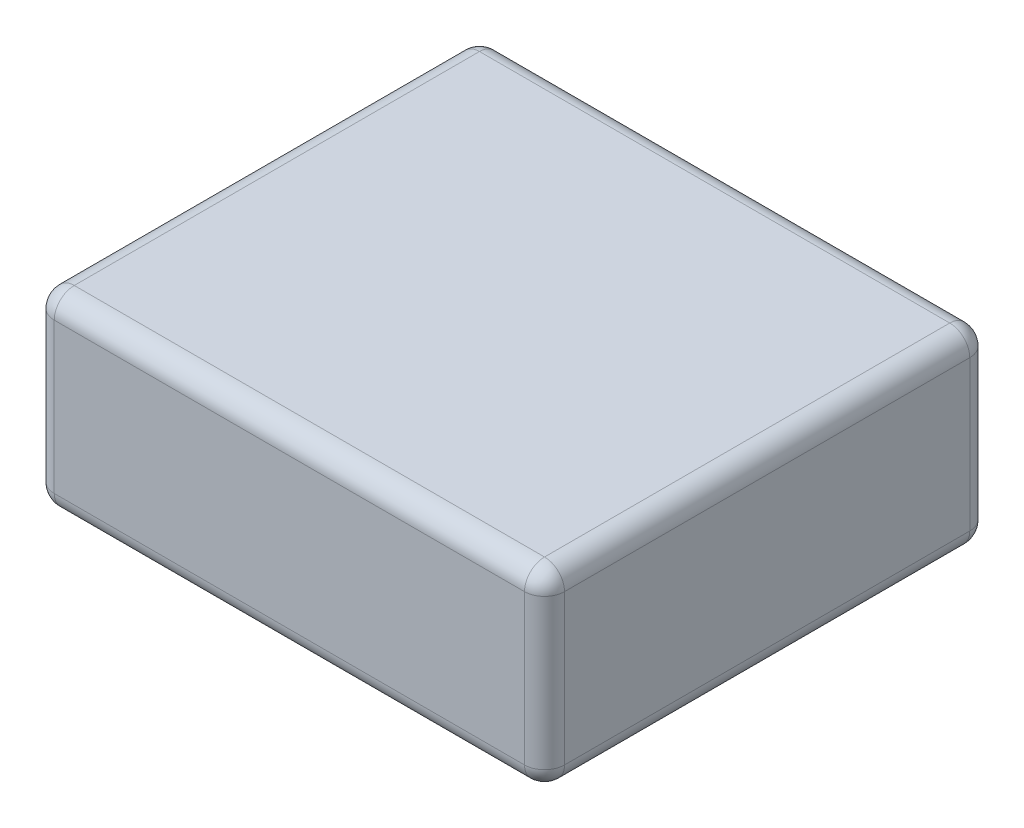
ISO-10303-21;
HEADER;
FILE_DESCRIPTION(('STEP AP214'),'2;1');
FILE_NAME('part.step','',(''),(''),'','','');
FILE_SCHEMA(('AUTOMOTIVE_DESIGN { 1 0 10303 214 1 1 1 1 }'));
ENDSEC;
DATA;
#1=APPLICATION_CONTEXT('core data for automotive mechanical design processes');
#2=APPLICATION_PROTOCOL_DEFINITION('international standard','automotive_design',2000,#1);
#3=PRODUCT_CONTEXT('',#1,'mechanical');
#4=PRODUCT('Part','Part','',(#3));
#5=PRODUCT_RELATED_PRODUCT_CATEGORY('part','',(#4));
#6=PRODUCT_DEFINITION_FORMATION('','',#4);
#7=PRODUCT_DEFINITION_CONTEXT('part definition',#1,'design');
#8=PRODUCT_DEFINITION('design','',#6,#7);
#9=PRODUCT_DEFINITION_SHAPE('','',#8);
#10=(LENGTH_UNIT() NAMED_UNIT(*) SI_UNIT(.MILLI.,.METRE.));
#11=(NAMED_UNIT(*) PLANE_ANGLE_UNIT() SI_UNIT($,.RADIAN.));
#12=(NAMED_UNIT(*) SI_UNIT($,.STERADIAN.) SOLID_ANGLE_UNIT());
#13=UNCERTAINTY_MEASURE_WITH_UNIT(LENGTH_MEASURE(1.E-05),#10,'distance_accuracy_value','');
#14=(GEOMETRIC_REPRESENTATION_CONTEXT(3) GLOBAL_UNCERTAINTY_ASSIGNED_CONTEXT((#13)) GLOBAL_UNIT_ASSIGNED_CONTEXT((#10,
#11,#12)) REPRESENTATION_CONTEXT('',''));
#15=CARTESIAN_POINT('',(0.,0.,0.));
#16=DIRECTION('',(0.,0.,1.));
#17=DIRECTION('',(1.,0.,0.));
#18=AXIS2_PLACEMENT_3D('',#15,#16,#17);
#19=CARTESIAN_POINT('',(-44.5,38.,-44.5));
#20=DIRECTION('',(1.,0.,0.));
#21=DIRECTION('',(0.,0.,-1.));
#22=AXIS2_PLACEMENT_3D('',#19,#20,#21);
#23=PLANE('',#22);
#24=DIRECTION('',(0.,0.,1.));
#25=VECTOR('',#24,1.);
#26=CARTESIAN_POINT('',(-44.5,34.,-44.5));
#27=LINE('',#26,#25);
#28=CARTESIAN_POINT('',(-44.5,34.,40.5));
#29=VERTEX_POINT('',#28);
#30=CARTESIAN_POINT('',(-44.5,34.,-40.5));
#31=VERTEX_POINT('',#30);
#32=EDGE_CURVE('E138',#29,#31,#27,.F.);
#33=ORIENTED_EDGE('',*,*,#32,.T.);
#34=DIRECTION('',(0.,-1.,0.));
#35=VECTOR('',#34,1.);
#36=CARTESIAN_POINT('',(-44.5,38.,-40.5));
#37=LINE('',#36,#35);
#38=CARTESIAN_POINT('',(-44.5,4.,-40.5));
#39=VERTEX_POINT('',#38);
#40=EDGE_CURVE('E181',#31,#39,#37,.T.);
#41=ORIENTED_EDGE('',*,*,#40,.T.);
#42=DIRECTION('',(0.,0.,1.));
#43=VECTOR('',#42,1.);
#44=CARTESIAN_POINT('',(-44.5,4.,-44.5));
#45=LINE('',#44,#43);
#46=CARTESIAN_POINT('',(-44.5,4.,40.5));
#47=VERTEX_POINT('',#46);
#48=EDGE_CURVE('E141',#39,#47,#45,.T.);
#49=ORIENTED_EDGE('',*,*,#48,.T.);
#50=DIRECTION('',(0.,-1.,0.));
#51=VECTOR('',#50,1.);
#52=CARTESIAN_POINT('',(-44.5,38.,40.5));
#53=LINE('',#52,#51);
#54=EDGE_CURVE('E134',#47,#29,#53,.F.);
#55=ORIENTED_EDGE('',*,*,#54,.T.);
#56=EDGE_LOOP('',(#33,#41,#49,#55));
#57=FACE_BOUND('',#56,.T.);
#58=ADVANCED_FACE('F45',(#57),#23,.F.);
#59=CARTESIAN_POINT('',(-44.5,38.,44.5));
#60=DIRECTION('',(0.,0.,-1.));
#61=DIRECTION('',(-1.,0.,0.));
#62=AXIS2_PLACEMENT_3D('',#59,#60,#61);
#63=PLANE('',#62);
#64=DIRECTION('',(0.,-1.,0.));
#65=VECTOR('',#64,1.);
#66=CARTESIAN_POINT('',(-40.5,38.,44.5));
#67=LINE('',#66,#65);
#68=CARTESIAN_POINT('',(-40.5,34.,44.5));
#69=VERTEX_POINT('',#68);
#70=CARTESIAN_POINT('',(-40.5,4.,44.5));
#71=VERTEX_POINT('',#70);
#72=EDGE_CURVE('E153',#69,#71,#67,.T.);
#73=ORIENTED_EDGE('',*,*,#72,.T.);
#74=DIRECTION('',(1.,0.,0.));
#75=VECTOR('',#74,1.);
#76=CARTESIAN_POINT('',(-44.5,4.,44.5));
#77=LINE('',#76,#75);
#78=CARTESIAN_POINT('',(53.5,4.,44.5));
#79=VERTEX_POINT('',#78);
#80=EDGE_CURVE('E231',#71,#79,#77,.T.);
#81=ORIENTED_EDGE('',*,*,#80,.T.);
#82=DIRECTION('',(0.,-1.,0.));
#83=VECTOR('',#82,1.);
#84=CARTESIAN_POINT('',(53.5,38.,44.5));
#85=LINE('',#84,#83);
#86=CARTESIAN_POINT('',(53.5,34.,44.5));
#87=VERTEX_POINT('',#86);
#88=EDGE_CURVE('E226',#79,#87,#85,.F.);
#89=ORIENTED_EDGE('',*,*,#88,.T.);
#90=DIRECTION('',(1.,0.,0.));
#91=VECTOR('',#90,1.);
#92=CARTESIAN_POINT('',(-44.5,34.,44.5));
#93=LINE('',#92,#91);
#94=EDGE_CURVE('E223',#87,#69,#93,.F.);
#95=ORIENTED_EDGE('',*,*,#94,.T.);
#96=EDGE_LOOP('',(#73,#81,#89,#95));
#97=FACE_BOUND('',#96,.T.);
#98=ADVANCED_FACE('F354',(#97),#63,.F.);
#99=CARTESIAN_POINT('',(57.5,38.,-44.5));
#100=DIRECTION('',(-1.,0.,0.));
#101=DIRECTION('',(0.,0.,1.));
#102=AXIS2_PLACEMENT_3D('',#99,#100,#101);
#103=PLANE('',#102);
#104=DIRECTION('',(0.,0.,-1.));
#105=VECTOR('',#104,1.);
#106=CARTESIAN_POINT('',(57.5,4.,-44.5));
#107=LINE('',#106,#105);
#108=CARTESIAN_POINT('',(57.5,4.,40.5));
#109=VERTEX_POINT('',#108);
#110=CARTESIAN_POINT('',(57.5,4.,-40.5));
#111=VERTEX_POINT('',#110);
#112=EDGE_CURVE('E216',#109,#111,#107,.T.);
#113=ORIENTED_EDGE('',*,*,#112,.T.);
#114=DIRECTION('',(0.,-1.,0.));
#115=VECTOR('',#114,1.);
#116=CARTESIAN_POINT('',(57.5,38.,-40.5));
#117=LINE('',#116,#115);
#118=CARTESIAN_POINT('',(57.5,34.,-40.5));
#119=VERTEX_POINT('',#118);
#120=EDGE_CURVE('E219',#111,#119,#117,.F.);
#121=ORIENTED_EDGE('',*,*,#120,.T.);
#122=DIRECTION('',(0.,0.,-1.));
#123=VECTOR('',#122,1.);
#124=CARTESIAN_POINT('',(57.5,34.,44.5));
#125=LINE('',#124,#123);
#126=CARTESIAN_POINT('',(57.5,34.,40.5));
#127=VERTEX_POINT('',#126);
#128=EDGE_CURVE('E210',#119,#127,#125,.F.);
#129=ORIENTED_EDGE('',*,*,#128,.T.);
#130=DIRECTION('',(0.,-1.,0.));
#131=VECTOR('',#130,1.);
#132=CARTESIAN_POINT('',(57.5,38.,40.5));
#133=LINE('',#132,#131);
#134=EDGE_CURVE('E213',#127,#109,#133,.T.);
#135=ORIENTED_EDGE('',*,*,#134,.T.);
#136=EDGE_LOOP('',(#113,#121,#129,#135));
#137=FACE_BOUND('',#136,.T.);
#138=ADVANCED_FACE('F333',(#137),#103,.F.);
#139=CARTESIAN_POINT('',(-44.5,38.,-44.5));
#140=DIRECTION('',(0.,0.,1.));
#141=DIRECTION('',(1.,0.,0.));
#142=AXIS2_PLACEMENT_3D('',#139,#140,#141);
#143=PLANE('',#142);
#144=DIRECTION('',(-1.,0.,0.));
#145=VECTOR('',#144,1.);
#146=CARTESIAN_POINT('',(-44.5,4.,-44.5));
#147=LINE('',#146,#145);
#148=CARTESIAN_POINT('',(53.5,4.,-44.5));
#149=VERTEX_POINT('',#148);
#150=CARTESIAN_POINT('',(-40.5,4.,-44.5));
#151=VERTEX_POINT('',#150);
#152=EDGE_CURVE('E190',#149,#151,#147,.T.);
#153=ORIENTED_EDGE('',*,*,#152,.T.);
#154=DIRECTION('',(0.,-1.,0.));
#155=VECTOR('',#154,1.);
#156=CARTESIAN_POINT('',(-40.5,38.,-44.5));
#157=LINE('',#156,#155);
#158=CARTESIAN_POINT('',(-40.5,34.,-44.5));
#159=VERTEX_POINT('',#158);
#160=EDGE_CURVE('E193',#151,#159,#157,.F.);
#161=ORIENTED_EDGE('',*,*,#160,.T.);
#162=DIRECTION('',(-1.,0.,0.));
#163=VECTOR('',#162,1.);
#164=CARTESIAN_POINT('',(57.5,34.,-44.5));
#165=LINE('',#164,#163);
#166=CARTESIAN_POINT('',(53.5,34.,-44.5));
#167=VERTEX_POINT('',#166);
#168=EDGE_CURVE('E184',#159,#167,#165,.F.);
#169=ORIENTED_EDGE('',*,*,#168,.T.);
#170=DIRECTION('',(0.,-1.,0.));
#171=VECTOR('',#170,1.);
#172=CARTESIAN_POINT('',(53.5,38.,-44.5));
#173=LINE('',#172,#171);
#174=EDGE_CURVE('E187',#167,#149,#173,.T.);
#175=ORIENTED_EDGE('',*,*,#174,.T.);
#176=EDGE_LOOP('',(#153,#161,#169,#175));
#177=FACE_BOUND('',#176,.T.);
#178=ADVANCED_FACE('F361',(#177),#143,.F.);
#179=CARTESIAN_POINT('',(0.,38.,0.));
#180=DIRECTION('',(0.,1.,0.));
#181=DIRECTION('',(0.,0.,1.));
#182=AXIS2_PLACEMENT_3D('',#179,#180,#181);
#183=PLANE('',#182);
#184=DIRECTION('',(0.,0.,-1.));
#185=VECTOR('',#184,1.);
#186=CARTESIAN_POINT('',(53.5,38.,-44.5));
#187=LINE('',#186,#185);
#188=CARTESIAN_POINT('',(53.5,38.,40.5));
#189=VERTEX_POINT('',#188);
#190=CARTESIAN_POINT('',(53.5,38.,-40.5));
#191=VERTEX_POINT('',#190);
#192=EDGE_CURVE('E55',#189,#191,#187,.T.);
#193=ORIENTED_EDGE('',*,*,#192,.T.);
#194=DIRECTION('',(-1.,0.,0.));
#195=VECTOR('',#194,1.);
#196=CARTESIAN_POINT('',(-44.5,38.,-40.5));
#197=LINE('',#196,#195);
#198=CARTESIAN_POINT('',(-40.5,38.,-40.5));
#199=VERTEX_POINT('',#198);
#200=EDGE_CURVE('E11',#191,#199,#197,.T.);
#201=ORIENTED_EDGE('',*,*,#200,.T.);
#202=DIRECTION('',(0.,0.,1.));
#203=VECTOR('',#202,1.);
#204=CARTESIAN_POINT('',(-40.5,38.,44.5));
#205=LINE('',#204,#203);
#206=CARTESIAN_POINT('',(-40.5,38.,40.5));
#207=VERTEX_POINT('',#206);
#208=EDGE_CURVE('E234',#199,#207,#205,.T.);
#209=ORIENTED_EDGE('',*,*,#208,.T.);
#210=DIRECTION('',(1.,0.,0.));
#211=VECTOR('',#210,1.);
#212=CARTESIAN_POINT('',(57.5,38.,40.5));
#213=LINE('',#212,#211);
#214=EDGE_CURVE('E66',#207,#189,#213,.T.);
#215=ORIENTED_EDGE('',*,*,#214,.T.);
#216=EDGE_LOOP('',(#193,#201,#209,#215));
#217=FACE_BOUND('',#216,.T.);
#218=ADVANCED_FACE('F425',(#217),#183,.T.);
#219=CARTESIAN_POINT('',(0.,0.,0.));
#220=DIRECTION('',(0.,1.,0.));
#221=DIRECTION('',(0.,0.,1.));
#222=AXIS2_PLACEMENT_3D('',#219,#220,#221);
#223=PLANE('',#222);
#224=DIRECTION('',(0.,0.,1.));
#225=VECTOR('',#224,1.);
#226=CARTESIAN_POINT('',(-40.5,0.,0.));
#227=LINE('',#226,#225);
#228=CARTESIAN_POINT('',(-40.5,0.,40.5));
#229=VERTEX_POINT('',#228);
#230=CARTESIAN_POINT('',(-40.5,0.,-40.5));
#231=VERTEX_POINT('',#230);
#232=EDGE_CURVE('E203',#229,#231,#227,.F.);
#233=ORIENTED_EDGE('',*,*,#232,.T.);
#234=DIRECTION('',(-1.,0.,0.));
#235=VECTOR('',#234,1.);
#236=CARTESIAN_POINT('',(0.,0.,-40.5));
#237=LINE('',#236,#235);
#238=CARTESIAN_POINT('',(53.5,0.,-40.5));
#239=VERTEX_POINT('',#238);
#240=EDGE_CURVE('E206',#231,#239,#237,.F.);
#241=ORIENTED_EDGE('',*,*,#240,.T.);
#242=DIRECTION('',(0.,0.,-1.));
#243=VECTOR('',#242,1.);
#244=CARTESIAN_POINT('',(53.5,0.,0.));
#245=LINE('',#244,#243);
#246=CARTESIAN_POINT('',(53.5,0.,40.5));
#247=VERTEX_POINT('',#246);
#248=EDGE_CURVE('E200',#239,#247,#245,.F.);
#249=ORIENTED_EDGE('',*,*,#248,.T.);
#250=DIRECTION('',(1.,0.,0.));
#251=VECTOR('',#250,1.);
#252=CARTESIAN_POINT('',(0.,0.,40.5));
#253=LINE('',#252,#251);
#254=EDGE_CURVE('E197',#247,#229,#253,.F.);
#255=ORIENTED_EDGE('',*,*,#254,.T.);
#256=EDGE_LOOP('',(#233,#241,#249,#255));
#257=FACE_BOUND('',#256,.T.);
#258=ADVANCED_FACE('F324',(#257),#223,.F.);
#259=CARTESIAN_POINT('',(53.5,38.,40.5));
#260=DIRECTION('',(0.,-1.,0.));
#261=DIRECTION('',(0.,0.,-1.));
#262=AXIS2_PLACEMENT_3D('',#259,#260,#261);
#263=CYLINDRICAL_SURFACE('',#262,4.);
#264=CARTESIAN_POINT('',(53.5,34.,40.5));
#265=DIRECTION('',(0.,1.,0.));
#266=DIRECTION('',(0.,0.,1.));
#267=AXIS2_PLACEMENT_3D('',#264,#265,#266);
#268=CIRCLE('',#267,4.);
#269=EDGE_CURVE('E49',#87,#127,#268,.T.);
#270=ORIENTED_EDGE('',*,*,#269,.F.);
#271=ORIENTED_EDGE('',*,*,#88,.F.);
#272=CARTESIAN_POINT('',(53.5,4.,40.5));
#273=DIRECTION('',(0.,-1.,0.));
#274=DIRECTION('',(0.,0.,-1.));
#275=AXIS2_PLACEMENT_3D('',#272,#273,#274);
#276=CIRCLE('',#275,4.);
#277=EDGE_CURVE('E177',#109,#79,#276,.T.);
#278=ORIENTED_EDGE('',*,*,#277,.F.);
#279=ORIENTED_EDGE('',*,*,#134,.F.);
#280=EDGE_LOOP('',(#270,#271,#278,#279));
#281=FACE_BOUND('',#280,.T.);
#282=ADVANCED_FACE('F47',(#281),#263,.T.);
#283=CARTESIAN_POINT('',(53.5,34.,40.5));
#284=DIRECTION('',(1.,0.,0.));
#285=DIRECTION('',(0.,0.,-1.));
#286=AXIS2_PLACEMENT_3D('',#283,#284,#285);
#287=SPHERICAL_SURFACE('',#286,4.);
#288=CARTESIAN_POINT('',(53.5,34.,40.5));
#289=DIRECTION('',(1.,0.,0.));
#290=DIRECTION('',(0.,0.,-1.));
#291=AXIS2_PLACEMENT_3D('',#288,#289,#290);
#292=CIRCLE('',#291,4.);
#293=EDGE_CURVE('E300',#87,#189,#292,.F.);
#294=ORIENTED_EDGE('',*,*,#293,.F.);
#295=ORIENTED_EDGE('',*,*,#269,.T.);
#296=CARTESIAN_POINT('',(53.5,34.,40.5));
#297=DIRECTION('',(0.,0.,1.));
#298=DIRECTION('',(0.,-1.,0.));
#299=AXIS2_PLACEMENT_3D('',#296,#297,#298);
#300=CIRCLE('',#299,4.);
#301=EDGE_CURVE('E303',#189,#127,#300,.F.);
#302=ORIENTED_EDGE('',*,*,#301,.F.);
#303=EDGE_LOOP('',(#294,#295,#302));
#304=FACE_BOUND('',#303,.T.);
#305=ADVANCED_FACE('F349',(#304),#287,.T.);
#306=CARTESIAN_POINT('',(53.5,4.,40.5));
#307=DIRECTION('',(0.,0.,1.));
#308=DIRECTION('',(0.,-1.,0.));
#309=AXIS2_PLACEMENT_3D('',#306,#307,#308);
#310=SPHERICAL_SURFACE('',#309,4.);
#311=CARTESIAN_POINT('',(53.5,4.,40.5));
#312=DIRECTION('',(0.,0.,1.));
#313=DIRECTION('',(1.,0.,0.));
#314=AXIS2_PLACEMENT_3D('',#311,#312,#313);
#315=CIRCLE('',#314,4.);
#316=EDGE_CURVE('E292',#109,#247,#315,.F.);
#317=ORIENTED_EDGE('',*,*,#316,.F.);
#318=ORIENTED_EDGE('',*,*,#277,.T.);
#319=CARTESIAN_POINT('',(53.5,4.,40.5));
#320=DIRECTION('',(1.,0.,0.));
#321=DIRECTION('',(0.,0.,-1.));
#322=AXIS2_PLACEMENT_3D('',#319,#320,#321);
#323=CIRCLE('',#322,4.);
#324=EDGE_CURVE('E296',#247,#79,#323,.F.);
#325=ORIENTED_EDGE('',*,*,#324,.F.);
#326=EDGE_LOOP('',(#317,#318,#325));
#327=FACE_BOUND('',#326,.T.);
#328=ADVANCED_FACE('F312',(#327),#310,.T.);
#329=CARTESIAN_POINT('',(53.5,34.,0.));
#330=DIRECTION('',(0.,0.,1.));
#331=DIRECTION('',(1.,0.,0.));
#332=AXIS2_PLACEMENT_3D('',#329,#330,#331);
#333=CYLINDRICAL_SURFACE('',#332,4.);
#334=ORIENTED_EDGE('',*,*,#301,.T.);
#335=ORIENTED_EDGE('',*,*,#128,.F.);
#336=CARTESIAN_POINT('',(53.5,34.,-40.5));
#337=DIRECTION('',(0.,0.,-1.));
#338=DIRECTION('',(-1.,0.,0.));
#339=AXIS2_PLACEMENT_3D('',#336,#337,#338);
#340=CIRCLE('',#339,4.);
#341=EDGE_CURVE('E285',#191,#119,#340,.T.);
#342=ORIENTED_EDGE('',*,*,#341,.F.);
#343=ORIENTED_EDGE('',*,*,#192,.F.);
#344=EDGE_LOOP('',(#334,#335,#342,#343));
#345=FACE_BOUND('',#344,.T.);
#346=ADVANCED_FACE('F344',(#345),#333,.T.);
#347=CARTESIAN_POINT('',(0.,34.,40.5));
#348=DIRECTION('',(-1.,0.,0.));
#349=DIRECTION('',(0.,0.,1.));
#350=AXIS2_PLACEMENT_3D('',#347,#348,#349);
#351=CYLINDRICAL_SURFACE('',#350,4.);
#352=ORIENTED_EDGE('',*,*,#293,.T.);
#353=ORIENTED_EDGE('',*,*,#214,.F.);
#354=CARTESIAN_POINT('',(-40.5,34.,40.5));
#355=DIRECTION('',(-1.,0.,0.));
#356=DIRECTION('',(0.,0.,1.));
#357=AXIS2_PLACEMENT_3D('',#354,#355,#356);
#358=CIRCLE('',#357,4.);
#359=EDGE_CURVE('E158',#69,#207,#358,.T.);
#360=ORIENTED_EDGE('',*,*,#359,.F.);
#361=ORIENTED_EDGE('',*,*,#94,.F.);
#362=EDGE_LOOP('',(#352,#353,#360,#361));
#363=FACE_BOUND('',#362,.T.);
#364=ADVANCED_FACE('F352',(#363),#351,.T.);
#365=CARTESIAN_POINT('',(-40.5,38.,40.5));
#366=DIRECTION('',(0.,-1.,0.));
#367=DIRECTION('',(0.,0.,-1.));
#368=AXIS2_PLACEMENT_3D('',#365,#366,#367);
#369=CYLINDRICAL_SURFACE('',#368,4.);
#370=CARTESIAN_POINT('',(-40.5,4.,40.5));
#371=DIRECTION('',(0.,-1.,0.));
#372=DIRECTION('',(0.,0.,-1.));
#373=AXIS2_PLACEMENT_3D('',#370,#371,#372);
#374=CIRCLE('',#373,4.);
#375=EDGE_CURVE('E159',#71,#47,#374,.T.);
#376=ORIENTED_EDGE('',*,*,#375,.F.);
#377=ORIENTED_EDGE('',*,*,#72,.F.);
#378=CARTESIAN_POINT('',(-40.5,34.,40.5));
#379=DIRECTION('',(0.,1.,0.));
#380=DIRECTION('',(0.,0.,1.));
#381=AXIS2_PLACEMENT_3D('',#378,#379,#380);
#382=CIRCLE('',#381,4.);
#383=EDGE_CURVE('E149',#29,#69,#382,.T.);
#384=ORIENTED_EDGE('',*,*,#383,.F.);
#385=ORIENTED_EDGE('',*,*,#54,.F.);
#386=EDGE_LOOP('',(#376,#377,#384,#385));
#387=FACE_BOUND('',#386,.T.);
#388=ADVANCED_FACE('F151',(#387),#369,.T.);
#389=CARTESIAN_POINT('',(-44.5,4.,40.5));
#390=DIRECTION('',(1.,0.,0.));
#391=DIRECTION('',(0.,0.,-1.));
#392=AXIS2_PLACEMENT_3D('',#389,#390,#391);
#393=CYLINDRICAL_SURFACE('',#392,4.);
#394=ORIENTED_EDGE('',*,*,#324,.T.);
#395=ORIENTED_EDGE('',*,*,#80,.F.);
#396=CARTESIAN_POINT('',(-40.5,4.,40.5));
#397=DIRECTION('',(-1.,0.,0.));
#398=DIRECTION('',(0.,0.,1.));
#399=AXIS2_PLACEMENT_3D('',#396,#397,#398);
#400=CIRCLE('',#399,4.);
#401=EDGE_CURVE('E278',#229,#71,#400,.T.);
#402=ORIENTED_EDGE('',*,*,#401,.F.);
#403=ORIENTED_EDGE('',*,*,#254,.F.);
#404=EDGE_LOOP('',(#394,#395,#402,#403));
#405=FACE_BOUND('',#404,.T.);
#406=ADVANCED_FACE('F320',(#405),#393,.T.);
#407=CARTESIAN_POINT('',(53.5,4.,-44.5));
#408=DIRECTION('',(0.,0.,-1.));
#409=DIRECTION('',(-1.,0.,0.));
#410=AXIS2_PLACEMENT_3D('',#407,#408,#409);
#411=CYLINDRICAL_SURFACE('',#410,4.);
#412=ORIENTED_EDGE('',*,*,#316,.T.);
#413=ORIENTED_EDGE('',*,*,#248,.F.);
#414=CARTESIAN_POINT('',(53.5,4.,-40.5));
#415=DIRECTION('',(0.,0.,-1.));
#416=DIRECTION('',(-1.,0.,0.));
#417=AXIS2_PLACEMENT_3D('',#414,#415,#416);
#418=CIRCLE('',#417,4.);
#419=EDGE_CURVE('E274',#111,#239,#418,.T.);
#420=ORIENTED_EDGE('',*,*,#419,.F.);
#421=ORIENTED_EDGE('',*,*,#112,.F.);
#422=EDGE_LOOP('',(#412,#413,#420,#421));
#423=FACE_BOUND('',#422,.T.);
#424=ADVANCED_FACE('F330',(#423),#411,.T.);
#425=CARTESIAN_POINT('',(53.5,38.,-40.5));
#426=DIRECTION('',(0.,-1.,0.));
#427=DIRECTION('',(0.,0.,-1.));
#428=AXIS2_PLACEMENT_3D('',#425,#426,#427);
#429=CYLINDRICAL_SURFACE('',#428,4.);
#430=CARTESIAN_POINT('',(53.5,34.,-40.5));
#431=DIRECTION('',(0.,1.,0.));
#432=DIRECTION('',(0.,0.,1.));
#433=AXIS2_PLACEMENT_3D('',#430,#431,#432);
#434=CIRCLE('',#433,4.);
#435=EDGE_CURVE('E288',#119,#167,#434,.T.);
#436=ORIENTED_EDGE('',*,*,#435,.F.);
#437=ORIENTED_EDGE('',*,*,#120,.F.);
#438=CARTESIAN_POINT('',(53.5,4.,-40.5));
#439=DIRECTION('',(0.,-1.,0.));
#440=DIRECTION('',(0.,0.,-1.));
#441=AXIS2_PLACEMENT_3D('',#438,#439,#440);
#442=CIRCLE('',#441,4.);
#443=EDGE_CURVE('E270',#149,#111,#442,.T.);
#444=ORIENTED_EDGE('',*,*,#443,.F.);
#445=ORIENTED_EDGE('',*,*,#174,.F.);
#446=EDGE_LOOP('',(#436,#437,#444,#445));
#447=FACE_BOUND('',#446,.T.);
#448=ADVANCED_FACE('F337',(#447),#429,.T.);
#449=CARTESIAN_POINT('',(53.5,34.,-40.5));
#450=DIRECTION('',(1.,0.,0.));
#451=DIRECTION('',(0.,0.,-1.));
#452=AXIS2_PLACEMENT_3D('',#449,#450,#451);
#453=SPHERICAL_SURFACE('',#452,4.);
#454=ORIENTED_EDGE('',*,*,#341,.T.);
#455=ORIENTED_EDGE('',*,*,#435,.T.);
#456=CARTESIAN_POINT('',(53.5,34.,-40.5));
#457=DIRECTION('',(1.,0.,0.));
#458=DIRECTION('',(0.,0.,-1.));
#459=AXIS2_PLACEMENT_3D('',#456,#457,#458);
#460=CIRCLE('',#459,4.);
#461=EDGE_CURVE('E167',#191,#167,#460,.F.);
#462=ORIENTED_EDGE('',*,*,#461,.F.);
#463=EDGE_LOOP('',(#454,#455,#462));
#464=FACE_BOUND('',#463,.T.);
#465=ADVANCED_FACE('F402',(#464),#453,.T.);
#466=CARTESIAN_POINT('',(-40.5,34.,40.5));
#467=DIRECTION('',(0.,0.,1.));
#468=DIRECTION('',(1.,0.,0.));
#469=AXIS2_PLACEMENT_3D('',#466,#467,#468);
#470=SPHERICAL_SURFACE('',#469,4.);
#471=ORIENTED_EDGE('',*,*,#383,.T.);
#472=ORIENTED_EDGE('',*,*,#359,.T.);
#473=CARTESIAN_POINT('',(-40.5,34.,40.5));
#474=DIRECTION('',(0.,0.,1.));
#475=DIRECTION('',(1.,0.,0.));
#476=AXIS2_PLACEMENT_3D('',#473,#474,#475);
#477=CIRCLE('',#476,4.);
#478=EDGE_CURVE('E162',#29,#207,#477,.F.);
#479=ORIENTED_EDGE('',*,*,#478,.F.);
#480=EDGE_LOOP('',(#471,#472,#479));
#481=FACE_BOUND('',#480,.T.);
#482=ADVANCED_FACE('F163',(#481),#470,.T.);
#483=CARTESIAN_POINT('',(-40.5,4.,40.5));
#484=DIRECTION('',(0.,0.,1.));
#485=DIRECTION('',(0.,-1.,0.));
#486=AXIS2_PLACEMENT_3D('',#483,#484,#485);
#487=SPHERICAL_SURFACE('',#486,4.);
#488=ORIENTED_EDGE('',*,*,#401,.T.);
#489=ORIENTED_EDGE('',*,*,#375,.T.);
#490=CARTESIAN_POINT('',(-40.5,4.,40.5));
#491=DIRECTION('',(0.,0.,1.));
#492=DIRECTION('',(1.,0.,0.));
#493=AXIS2_PLACEMENT_3D('',#490,#491,#492);
#494=CIRCLE('',#493,4.);
#495=EDGE_CURVE('E168',#229,#47,#494,.F.);
#496=ORIENTED_EDGE('',*,*,#495,.F.);
#497=EDGE_LOOP('',(#488,#489,#496));
#498=FACE_BOUND('',#497,.T.);
#499=ADVANCED_FACE('F395',(#498),#487,.T.);
#500=CARTESIAN_POINT('',(53.5,4.,-40.5));
#501=DIRECTION('',(1.,0.,0.));
#502=DIRECTION('',(0.,1.,0.));
#503=AXIS2_PLACEMENT_3D('',#500,#501,#502);
#504=SPHERICAL_SURFACE('',#503,4.);
#505=ORIENTED_EDGE('',*,*,#443,.T.);
#506=ORIENTED_EDGE('',*,*,#419,.T.);
#507=CARTESIAN_POINT('',(53.5,4.,-40.5));
#508=DIRECTION('',(1.,0.,0.));
#509=DIRECTION('',(0.,0.,-1.));
#510=AXIS2_PLACEMENT_3D('',#507,#508,#509);
#511=CIRCLE('',#510,4.);
#512=EDGE_CURVE('E261',#149,#239,#511,.F.);
#513=ORIENTED_EDGE('',*,*,#512,.F.);
#514=EDGE_LOOP('',(#505,#506,#513));
#515=FACE_BOUND('',#514,.T.);
#516=ADVANCED_FACE('F391',(#515),#504,.T.);
#517=CARTESIAN_POINT('',(0.,34.,-40.5));
#518=DIRECTION('',(1.,0.,0.));
#519=DIRECTION('',(0.,0.,-1.));
#520=AXIS2_PLACEMENT_3D('',#517,#518,#519);
#521=CYLINDRICAL_SURFACE('',#520,4.);
#522=ORIENTED_EDGE('',*,*,#461,.T.);
#523=ORIENTED_EDGE('',*,*,#168,.F.);
#524=CARTESIAN_POINT('',(-40.5,34.,-40.5));
#525=DIRECTION('',(-1.,0.,0.));
#526=DIRECTION('',(0.,0.,1.));
#527=AXIS2_PLACEMENT_3D('',#524,#525,#526);
#528=CIRCLE('',#527,4.);
#529=EDGE_CURVE('E257',#199,#159,#528,.T.);
#530=ORIENTED_EDGE('',*,*,#529,.F.);
#531=ORIENTED_EDGE('',*,*,#200,.F.);
#532=EDGE_LOOP('',(#522,#523,#530,#531));
#533=FACE_BOUND('',#532,.T.);
#534=ADVANCED_FACE('F388',(#533),#521,.T.);
#535=CARTESIAN_POINT('',(-40.5,34.,0.));
#536=DIRECTION('',(0.,0.,-1.));
#537=DIRECTION('',(-1.,0.,0.));
#538=AXIS2_PLACEMENT_3D('',#535,#536,#537);
#539=CYLINDRICAL_SURFACE('',#538,4.);
#540=ORIENTED_EDGE('',*,*,#478,.T.);
#541=ORIENTED_EDGE('',*,*,#208,.F.);
#542=CARTESIAN_POINT('',(-40.5,34.,-40.5));
#543=DIRECTION('',(0.,0.,-1.));
#544=DIRECTION('',(-1.,0.,0.));
#545=AXIS2_PLACEMENT_3D('',#542,#543,#544);
#546=CIRCLE('',#545,4.);
#547=EDGE_CURVE('E171',#31,#199,#546,.T.);
#548=ORIENTED_EDGE('',*,*,#547,.F.);
#549=ORIENTED_EDGE('',*,*,#32,.F.);
#550=EDGE_LOOP('',(#540,#541,#548,#549));
#551=FACE_BOUND('',#550,.T.);
#552=ADVANCED_FACE('F170',(#551),#539,.T.);
#553=CARTESIAN_POINT('',(-40.5,4.,-44.5));
#554=DIRECTION('',(0.,0.,1.));
#555=DIRECTION('',(1.,0.,0.));
#556=AXIS2_PLACEMENT_3D('',#553,#554,#555);
#557=CYLINDRICAL_SURFACE('',#556,4.);
#558=ORIENTED_EDGE('',*,*,#495,.T.);
#559=ORIENTED_EDGE('',*,*,#48,.F.);
#560=CARTESIAN_POINT('',(-40.5,4.,-40.5));
#561=DIRECTION('',(0.,0.,-1.));
#562=DIRECTION('',(-1.,0.,0.));
#563=AXIS2_PLACEMENT_3D('',#560,#561,#562);
#564=CIRCLE('',#563,4.);
#565=EDGE_CURVE('E251',#231,#39,#564,.T.);
#566=ORIENTED_EDGE('',*,*,#565,.F.);
#567=ORIENTED_EDGE('',*,*,#232,.F.);
#568=EDGE_LOOP('',(#558,#559,#566,#567));
#569=FACE_BOUND('',#568,.T.);
#570=ADVANCED_FACE('F381',(#569),#557,.T.);
#571=CARTESIAN_POINT('',(-44.5,4.,-40.5));
#572=DIRECTION('',(-1.,0.,0.));
#573=DIRECTION('',(0.,0.,1.));
#574=AXIS2_PLACEMENT_3D('',#571,#572,#573);
#575=CYLINDRICAL_SURFACE('',#574,4.);
#576=ORIENTED_EDGE('',*,*,#512,.T.);
#577=ORIENTED_EDGE('',*,*,#240,.F.);
#578=CARTESIAN_POINT('',(-40.5,4.,-40.5));
#579=DIRECTION('',(-1.,0.,0.));
#580=DIRECTION('',(0.,0.,1.));
#581=AXIS2_PLACEMENT_3D('',#578,#579,#580);
#582=CIRCLE('',#581,4.);
#583=EDGE_CURVE('E247',#151,#231,#582,.T.);
#584=ORIENTED_EDGE('',*,*,#583,.F.);
#585=ORIENTED_EDGE('',*,*,#152,.F.);
#586=EDGE_LOOP('',(#576,#577,#584,#585));
#587=FACE_BOUND('',#586,.T.);
#588=ADVANCED_FACE('F377',(#587),#575,.T.);
#589=CARTESIAN_POINT('',(-40.5,34.,-40.5));
#590=DIRECTION('',(0.,1.,0.));
#591=DIRECTION('',(0.,0.,1.));
#592=AXIS2_PLACEMENT_3D('',#589,#590,#591);
#593=SPHERICAL_SURFACE('',#592,4.);
#594=ORIENTED_EDGE('',*,*,#547,.T.);
#595=ORIENTED_EDGE('',*,*,#529,.T.);
#596=CARTESIAN_POINT('',(-40.5,34.,-40.5));
#597=DIRECTION('',(0.,1.,0.));
#598=DIRECTION('',(0.,0.,1.));
#599=AXIS2_PLACEMENT_3D('',#596,#597,#598);
#600=CIRCLE('',#599,4.);
#601=EDGE_CURVE('E244',#31,#159,#600,.F.);
#602=ORIENTED_EDGE('',*,*,#601,.F.);
#603=EDGE_LOOP('',(#594,#595,#602));
#604=FACE_BOUND('',#603,.T.);
#605=ADVANCED_FACE('F373',(#604),#593,.T.);
#606=CARTESIAN_POINT('',(-40.5,4.,-40.5));
#607=DIRECTION('',(0.,-1.,0.));
#608=DIRECTION('',(0.,0.,-1.));
#609=AXIS2_PLACEMENT_3D('',#606,#607,#608);
#610=SPHERICAL_SURFACE('',#609,4.);
#611=ORIENTED_EDGE('',*,*,#583,.T.);
#612=ORIENTED_EDGE('',*,*,#565,.T.);
#613=CARTESIAN_POINT('',(-40.5,4.,-40.5));
#614=DIRECTION('',(0.,-1.,0.));
#615=DIRECTION('',(0.,0.,-1.));
#616=AXIS2_PLACEMENT_3D('',#613,#614,#615);
#617=CIRCLE('',#616,4.);
#618=EDGE_CURVE('E241',#151,#39,#617,.F.);
#619=ORIENTED_EDGE('',*,*,#618,.F.);
#620=EDGE_LOOP('',(#611,#612,#619));
#621=FACE_BOUND('',#620,.T.);
#622=ADVANCED_FACE('F369',(#621),#610,.T.);
#623=CARTESIAN_POINT('',(-40.5,38.,-40.5));
#624=DIRECTION('',(0.,-1.,0.));
#625=DIRECTION('',(0.,0.,-1.));
#626=AXIS2_PLACEMENT_3D('',#623,#624,#625);
#627=CYLINDRICAL_SURFACE('',#626,4.);
#628=ORIENTED_EDGE('',*,*,#601,.T.);
#629=ORIENTED_EDGE('',*,*,#160,.F.);
#630=ORIENTED_EDGE('',*,*,#618,.T.);
#631=ORIENTED_EDGE('',*,*,#40,.F.);
#632=EDGE_LOOP('',(#628,#629,#630,#631));
#633=FACE_BOUND('',#632,.T.);
#634=ADVANCED_FACE('F366',(#633),#627,.T.);
#635=CLOSED_SHELL('',(#58,#98,#138,#178,#218,#258,#282,#305,#328,#346,#364,#388,#406,#424,#448,
#465,#482,#499,#516,#534,#552,#570,#588,#605,#622,#634));
#636=MANIFOLD_SOLID_BREP('B2',#635);
#637=ADVANCED_BREP_SHAPE_REPRESENTATION('',(#18,#636),#14);
#638=SHAPE_DEFINITION_REPRESENTATION(#9,#637);
ENDSEC;
END-ISO-10303-21;
